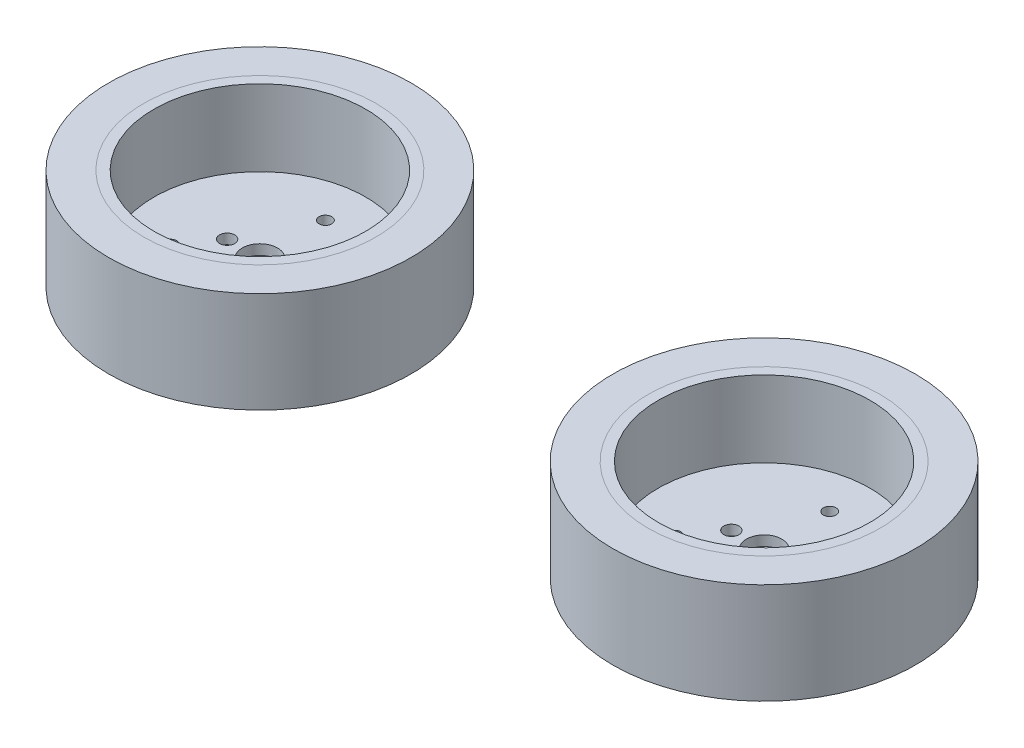
ISO-10303-21;
HEADER;
FILE_DESCRIPTION(('STEP AP214'),'2;1');
FILE_NAME('part.step','',(''),(''),'','','');
FILE_SCHEMA(('AUTOMOTIVE_DESIGN { 1 0 10303 214 1 1 1 1 }'));
ENDSEC;
DATA;
#1=APPLICATION_CONTEXT('core data for automotive mechanical design processes');
#2=APPLICATION_PROTOCOL_DEFINITION('international standard','automotive_design',2000,#1);
#3=PRODUCT_CONTEXT('',#1,'mechanical');
#4=PRODUCT('Part','Part','',(#3));
#5=PRODUCT_RELATED_PRODUCT_CATEGORY('part','',(#4));
#6=PRODUCT_DEFINITION_FORMATION('','',#4);
#7=PRODUCT_DEFINITION_CONTEXT('part definition',#1,'design');
#8=PRODUCT_DEFINITION('design','',#6,#7);
#9=PRODUCT_DEFINITION_SHAPE('','',#8);
#10=(LENGTH_UNIT() NAMED_UNIT(*) SI_UNIT(.MILLI.,.METRE.));
#11=(NAMED_UNIT(*) PLANE_ANGLE_UNIT() SI_UNIT($,.RADIAN.));
#12=(NAMED_UNIT(*) SI_UNIT($,.STERADIAN.) SOLID_ANGLE_UNIT());
#13=UNCERTAINTY_MEASURE_WITH_UNIT(LENGTH_MEASURE(1.E-05),#10,'distance_accuracy_value','');
#14=(GEOMETRIC_REPRESENTATION_CONTEXT(3) GLOBAL_UNCERTAINTY_ASSIGNED_CONTEXT((#13)) GLOBAL_UNIT_ASSIGNED_CONTEXT((#10,
#11,#12)) REPRESENTATION_CONTEXT('',''));
#15=CARTESIAN_POINT('',(0.,0.,0.));
#16=DIRECTION('',(0.,0.,1.));
#17=DIRECTION('',(1.,0.,0.));
#18=AXIS2_PLACEMENT_3D('',#15,#16,#17);
#19=CARTESIAN_POINT('',(50.,37.,0.));
#20=DIRECTION('',(0.,1.,0.));
#21=DIRECTION('',(0.,0.,1.));
#22=AXIS2_PLACEMENT_3D('',#19,#20,#21);
#23=CYLINDRICAL_SURFACE('',#22,21.);
#24=CARTESIAN_POINT('',(50.,-7.1,0.));
#25=DIRECTION('',(0.,-1.,0.));
#26=DIRECTION('',(0.,0.,1.));
#27=AXIS2_PLACEMENT_3D('',#24,#25,#26);
#28=CIRCLE('',#27,21.);
#29=CARTESIAN_POINT('',(50.,-7.1,21.));
#30=VERTEX_POINT('',#29);
#31=EDGE_CURVE('E88',#30,#30,#28,.T.);
#32=ORIENTED_EDGE('',*,*,#31,.F.);
#33=EDGE_LOOP('',(#32));
#34=FACE_BOUND('',#33,.T.);
#35=CARTESIAN_POINT('',(50.,-10.,0.));
#36=DIRECTION('',(0.,-1.,0.));
#37=DIRECTION('',(0.,0.,1.));
#38=AXIS2_PLACEMENT_3D('',#35,#36,#37);
#39=CIRCLE('',#38,21.);
#40=CARTESIAN_POINT('',(50.,-10.,21.));
#41=VERTEX_POINT('',#40);
#42=EDGE_CURVE('E11',#41,#41,#39,.T.);
#43=ORIENTED_EDGE('',*,*,#42,.T.);
#44=EDGE_LOOP('',(#43));
#45=FACE_BOUND('',#44,.T.);
#46=ADVANCED_FACE('F48',(#34,#45),#23,.F.);
#47=CARTESIAN_POINT('',(0.,-10.,0.));
#48=DIRECTION('',(0.,-1.,0.));
#49=DIRECTION('',(0.,0.,-1.));
#50=AXIS2_PLACEMENT_3D('',#47,#48,#49);
#51=PLANE('',#50);
#52=ORIENTED_EDGE('',*,*,#42,.F.);
#53=EDGE_LOOP('',(#52));
#54=FACE_BOUND('',#53,.T.);
#55=CARTESIAN_POINT('',(50.,-10.,0.));
#56=DIRECTION('',(0.,-1.,0.));
#57=DIRECTION('',(0.,0.,1.));
#58=AXIS2_PLACEMENT_3D('',#55,#56,#57);
#59=CIRCLE('',#58,23.);
#60=CARTESIAN_POINT('',(50.,-10.,23.));
#61=VERTEX_POINT('',#60);
#62=EDGE_CURVE('E54',#61,#61,#59,.T.);
#63=ORIENTED_EDGE('',*,*,#62,.T.);
#64=EDGE_LOOP('',(#63));
#65=FACE_BOUND('',#64,.T.);
#66=ADVANCED_FACE('F163',(#54,#65),#51,.T.);
#67=CARTESIAN_POINT('',(50.,37.,0.));
#68=DIRECTION('',(0.,1.,0.));
#69=DIRECTION('',(0.,0.,1.));
#70=AXIS2_PLACEMENT_3D('',#67,#68,#69);
#71=CYLINDRICAL_SURFACE('',#70,23.);
#72=ORIENTED_EDGE('',*,*,#62,.F.);
#73=EDGE_LOOP('',(#72));
#74=FACE_BOUND('',#73,.T.);
#75=CARTESIAN_POINT('',(50.,10.,0.));
#76=DIRECTION('',(0.,-1.,0.));
#77=DIRECTION('',(0.,0.,1.));
#78=AXIS2_PLACEMENT_3D('',#75,#76,#77);
#79=CIRCLE('',#78,23.);
#80=CARTESIAN_POINT('',(50.,10.,23.));
#81=VERTEX_POINT('',#80);
#82=EDGE_CURVE('E58',#81,#81,#79,.T.);
#83=ORIENTED_EDGE('',*,*,#82,.T.);
#84=EDGE_LOOP('',(#83));
#85=FACE_BOUND('',#84,.T.);
#86=ADVANCED_FACE('F158',(#74,#85),#71,.T.);
#87=CARTESIAN_POINT('',(0.,10.,0.));
#88=DIRECTION('',(0.,-1.,0.));
#89=DIRECTION('',(0.,0.,-1.));
#90=AXIS2_PLACEMENT_3D('',#87,#88,#89);
#91=PLANE('',#90);
#92=CARTESIAN_POINT('',(50.,10.,0.));
#93=DIRECTION('',(0.,-1.,0.));
#94=DIRECTION('',(0.,0.,1.));
#95=AXIS2_PLACEMENT_3D('',#92,#93,#94);
#96=CIRCLE('',#95,21.);
#97=CARTESIAN_POINT('',(50.,10.,21.));
#98=VERTEX_POINT('',#97);
#99=EDGE_CURVE('E62',#98,#98,#96,.T.);
#100=ORIENTED_EDGE('',*,*,#99,.T.);
#101=EDGE_LOOP('',(#100));
#102=FACE_BOUND('',#101,.T.);
#103=ORIENTED_EDGE('',*,*,#82,.F.);
#104=EDGE_LOOP('',(#103));
#105=FACE_BOUND('',#104,.T.);
#106=ADVANCED_FACE('F152',(#102,#105),#91,.F.);
#107=CARTESIAN_POINT('',(50.,37.,0.));
#108=DIRECTION('',(0.,1.,0.));
#109=DIRECTION('',(0.,0.,1.));
#110=AXIS2_PLACEMENT_3D('',#107,#108,#109);
#111=CYLINDRICAL_SURFACE('',#110,21.);
#112=CARTESIAN_POINT('',(50.,-5.1,0.));
#113=DIRECTION('',(0.,-1.,0.));
#114=DIRECTION('',(0.,0.,1.));
#115=AXIS2_PLACEMENT_3D('',#112,#113,#114);
#116=CIRCLE('',#115,21.);
#117=CARTESIAN_POINT('',(50.,-5.1,21.));
#118=VERTEX_POINT('',#117);
#119=EDGE_CURVE('E67',#118,#118,#116,.T.);
#120=ORIENTED_EDGE('',*,*,#119,.T.);
#121=EDGE_LOOP('',(#120));
#122=FACE_BOUND('',#121,.T.);
#123=ORIENTED_EDGE('',*,*,#99,.F.);
#124=EDGE_LOOP('',(#123));
#125=FACE_BOUND('',#124,.T.);
#126=ADVANCED_FACE('F136',(#122,#125),#111,.F.);
#127=CARTESIAN_POINT('',(0.,-5.1,0.));
#128=DIRECTION('',(0.,-1.,0.));
#129=DIRECTION('',(0.,0.,-1.));
#130=AXIS2_PLACEMENT_3D('',#127,#128,#129);
#131=PLANE('',#130);
#132=CARTESIAN_POINT('',(50.,-5.1,-13.));
#133=DIRECTION('',(0.,1.,0.));
#134=DIRECTION('',(0.,0.,-1.));
#135=AXIS2_PLACEMENT_3D('',#132,#133,#134);
#136=CIRCLE('',#135,1.24999999999999);
#137=CARTESIAN_POINT('',(50.,-5.1,-14.25));
#138=VERTEX_POINT('',#137);
#139=EDGE_CURVE('E115',#138,#138,#136,.T.);
#140=ORIENTED_EDGE('',*,*,#139,.F.);
#141=EDGE_LOOP('',(#140));
#142=FACE_BOUND('',#141,.T.);
#143=CARTESIAN_POINT('',(61.2583302491977,-5.1,6.5));
#144=DIRECTION('',(0.,1.,0.));
#145=DIRECTION('',(0.,0.,-1.));
#146=AXIS2_PLACEMENT_3D('',#143,#144,#145);
#147=CIRCLE('',#146,1.24999999999999);
#148=CARTESIAN_POINT('',(61.2583302491977,-5.1,5.25));
#149=VERTEX_POINT('',#148);
#150=EDGE_CURVE('E109',#149,#149,#147,.T.);
#151=ORIENTED_EDGE('',*,*,#150,.F.);
#152=EDGE_LOOP('',(#151));
#153=FACE_BOUND('',#152,.T.);
#154=CARTESIAN_POINT('',(38.7416697508023,-5.1,6.5));
#155=DIRECTION('',(0.,1.,0.));
#156=DIRECTION('',(0.,0.,-1.));
#157=AXIS2_PLACEMENT_3D('',#154,#155,#156);
#158=CIRCLE('',#157,1.24999999999999);
#159=CARTESIAN_POINT('',(38.7416697508023,-5.1,5.25));
#160=VERTEX_POINT('',#159);
#161=EDGE_CURVE('E101',#160,#160,#158,.T.);
#162=ORIENTED_EDGE('',*,*,#161,.F.);
#163=EDGE_LOOP('',(#162));
#164=FACE_BOUND('',#163,.T.);
#165=CARTESIAN_POINT('',(43.5,-5.1,0.));
#166=DIRECTION('',(0.,1.,0.));
#167=DIRECTION('',(0.,0.,-1.));
#168=AXIS2_PLACEMENT_3D('',#165,#166,#167);
#169=CIRCLE('',#168,1.5);
#170=CARTESIAN_POINT('',(43.5,-5.1,-1.5));
#171=VERTEX_POINT('',#170);
#172=EDGE_CURVE('E91',#171,#171,#169,.T.);
#173=ORIENTED_EDGE('',*,*,#172,.F.);
#174=EDGE_LOOP('',(#173));
#175=FACE_BOUND('',#174,.T.);
#176=CARTESIAN_POINT('',(56.5,-5.1,0.));
#177=DIRECTION('',(0.,1.,0.));
#178=DIRECTION('',(0.,0.,-1.));
#179=AXIS2_PLACEMENT_3D('',#176,#177,#178);
#180=CIRCLE('',#179,1.5);
#181=CARTESIAN_POINT('',(56.5,-5.1,-1.50000000000001));
#182=VERTEX_POINT('',#181);
#183=EDGE_CURVE('E94',#182,#182,#180,.T.);
#184=ORIENTED_EDGE('',*,*,#183,.F.);
#185=EDGE_LOOP('',(#184));
#186=FACE_BOUND('',#185,.T.);
#187=CARTESIAN_POINT('',(50.,-5.10000000000001,0.));
#188=DIRECTION('',(0.,-1.,0.));
#189=DIRECTION('',(0.,0.,1.));
#190=AXIS2_PLACEMENT_3D('',#187,#188,#189);
#191=CIRCLE('',#190,3.5);
#192=CARTESIAN_POINT('',(50.,-5.10000000000001,3.5));
#193=VERTEX_POINT('',#192);
#194=EDGE_CURVE('E70',#193,#193,#191,.T.);
#195=ORIENTED_EDGE('',*,*,#194,.T.);
#196=EDGE_LOOP('',(#195));
#197=FACE_BOUND('',#196,.T.);
#198=ORIENTED_EDGE('',*,*,#119,.F.);
#199=EDGE_LOOP('',(#198));
#200=FACE_BOUND('',#199,.T.);
#201=ADVANCED_FACE('F132',(#142,#153,#164,#175,#186,#197,#200),#131,.F.);
#202=CARTESIAN_POINT('',(50.,37.,0.));
#203=DIRECTION('',(0.,1.,0.));
#204=DIRECTION('',(0.,0.,1.));
#205=AXIS2_PLACEMENT_3D('',#202,#203,#204);
#206=CYLINDRICAL_SURFACE('',#205,3.5);
#207=CARTESIAN_POINT('',(50.,-7.1,0.));
#208=DIRECTION('',(0.,-1.,0.));
#209=DIRECTION('',(0.,0.,1.));
#210=AXIS2_PLACEMENT_3D('',#207,#208,#209);
#211=CIRCLE('',#210,3.5);
#212=CARTESIAN_POINT('',(50.,-7.1,3.5));
#213=VERTEX_POINT('',#212);
#214=EDGE_CURVE('E73',#213,#213,#211,.T.);
#215=ORIENTED_EDGE('',*,*,#214,.T.);
#216=EDGE_LOOP('',(#215));
#217=FACE_BOUND('',#216,.T.);
#218=ORIENTED_EDGE('',*,*,#194,.F.);
#219=EDGE_LOOP('',(#218));
#220=FACE_BOUND('',#219,.T.);
#221=ADVANCED_FACE('F135',(#217,#220),#206,.F.);
#222=CARTESIAN_POINT('',(0.,-7.1,0.));
#223=DIRECTION('',(0.,1.,0.));
#224=DIRECTION('',(0.,0.,1.));
#225=AXIS2_PLACEMENT_3D('',#222,#223,#224);
#226=PLANE('',#225);
#227=CARTESIAN_POINT('',(43.5,-7.1,0.));
#228=DIRECTION('',(0.,1.,0.));
#229=DIRECTION('',(0.,0.,-1.));
#230=AXIS2_PLACEMENT_3D('',#227,#228,#229);
#231=CIRCLE('',#230,1.5);
#232=CARTESIAN_POINT('',(43.5,-7.1,-1.5));
#233=VERTEX_POINT('',#232);
#234=EDGE_CURVE('E97',#233,#233,#231,.T.);
#235=ORIENTED_EDGE('',*,*,#234,.T.);
#236=EDGE_LOOP('',(#235));
#237=FACE_BOUND('',#236,.T.);
#238=CARTESIAN_POINT('',(56.5,-7.1,0.));
#239=DIRECTION('',(0.,1.,0.));
#240=DIRECTION('',(0.,0.,-1.));
#241=AXIS2_PLACEMENT_3D('',#238,#239,#240);
#242=CIRCLE('',#241,1.5);
#243=CARTESIAN_POINT('',(56.5,-7.1,-1.50000000000001));
#244=VERTEX_POINT('',#243);
#245=EDGE_CURVE('E98',#244,#244,#242,.T.);
#246=ORIENTED_EDGE('',*,*,#245,.T.);
#247=EDGE_LOOP('',(#246));
#248=FACE_BOUND('',#247,.T.);
#249=CARTESIAN_POINT('',(50.,-7.1,0.));
#250=DIRECTION('',(0.,-1.,0.));
#251=DIRECTION('',(0.,0.,1.));
#252=AXIS2_PLACEMENT_3D('',#249,#250,#251);
#253=CIRCLE('',#252,10.5);
#254=CARTESIAN_POINT('',(50.,-7.1,10.5));
#255=VERTEX_POINT('',#254);
#256=EDGE_CURVE('E76',#255,#255,#253,.T.);
#257=ORIENTED_EDGE('',*,*,#256,.T.);
#258=EDGE_LOOP('',(#257));
#259=FACE_BOUND('',#258,.T.);
#260=ORIENTED_EDGE('',*,*,#214,.F.);
#261=EDGE_LOOP('',(#260));
#262=FACE_BOUND('',#261,.T.);
#263=ADVANCED_FACE('F195',(#237,#248,#259,#262),#226,.F.);
#264=CARTESIAN_POINT('',(50.,37.,0.));
#265=DIRECTION('',(0.,1.,0.));
#266=DIRECTION('',(0.,0.,1.));
#267=AXIS2_PLACEMENT_3D('',#264,#265,#266);
#268=CYLINDRICAL_SURFACE('',#267,10.5);
#269=ORIENTED_EDGE('',*,*,#256,.F.);
#270=EDGE_LOOP('',(#269));
#271=FACE_BOUND('',#270,.T.);
#272=CARTESIAN_POINT('',(50.,-10.,0.));
#273=DIRECTION('',(0.,-1.,0.));
#274=DIRECTION('',(0.,0.,1.));
#275=AXIS2_PLACEMENT_3D('',#272,#273,#274);
#276=CIRCLE('',#275,10.5);
#277=CARTESIAN_POINT('',(50.,-10.,10.5));
#278=VERTEX_POINT('',#277);
#279=EDGE_CURVE('E79',#278,#278,#276,.T.);
#280=ORIENTED_EDGE('',*,*,#279,.T.);
#281=EDGE_LOOP('',(#280));
#282=FACE_BOUND('',#281,.T.);
#283=ADVANCED_FACE('F190',(#271,#282),#268,.F.);
#284=CARTESIAN_POINT('',(0.,-10.,0.));
#285=DIRECTION('',(0.,-1.,0.));
#286=DIRECTION('',(0.,0.,-1.));
#287=AXIS2_PLACEMENT_3D('',#284,#285,#286);
#288=PLANE('',#287);
#289=CARTESIAN_POINT('',(50.,-10.,-13.));
#290=DIRECTION('',(0.,1.,0.));
#291=DIRECTION('',(0.,0.,-1.));
#292=AXIS2_PLACEMENT_3D('',#289,#290,#291);
#293=CIRCLE('',#292,1.24999999999999);
#294=CARTESIAN_POINT('',(50.,-10.,-14.25));
#295=VERTEX_POINT('',#294);
#296=EDGE_CURVE('E118',#295,#295,#293,.T.);
#297=ORIENTED_EDGE('',*,*,#296,.T.);
#298=EDGE_LOOP('',(#297));
#299=FACE_BOUND('',#298,.T.);
#300=CARTESIAN_POINT('',(61.2583302491977,-10.,6.5));
#301=DIRECTION('',(0.,1.,0.));
#302=DIRECTION('',(0.,0.,-1.));
#303=AXIS2_PLACEMENT_3D('',#300,#301,#302);
#304=CIRCLE('',#303,1.24999999999999);
#305=CARTESIAN_POINT('',(61.2583302491977,-10.,5.25));
#306=VERTEX_POINT('',#305);
#307=EDGE_CURVE('E112',#306,#306,#304,.T.);
#308=ORIENTED_EDGE('',*,*,#307,.T.);
#309=EDGE_LOOP('',(#308));
#310=FACE_BOUND('',#309,.T.);
#311=CARTESIAN_POINT('',(38.7416697508023,-10.,6.5));
#312=DIRECTION('',(0.,1.,0.));
#313=DIRECTION('',(0.,0.,-1.));
#314=AXIS2_PLACEMENT_3D('',#311,#312,#313);
#315=CIRCLE('',#314,1.24999999999999);
#316=CARTESIAN_POINT('',(38.7416697508023,-10.,5.25));
#317=VERTEX_POINT('',#316);
#318=EDGE_CURVE('E106',#317,#317,#315,.T.);
#319=ORIENTED_EDGE('',*,*,#318,.T.);
#320=EDGE_LOOP('',(#319));
#321=FACE_BOUND('',#320,.T.);
#322=ORIENTED_EDGE('',*,*,#279,.F.);
#323=EDGE_LOOP('',(#322));
#324=FACE_BOUND('',#323,.T.);
#325=CARTESIAN_POINT('',(50.,-10.,0.));
#326=DIRECTION('',(0.,-1.,0.));
#327=DIRECTION('',(0.,0.,1.));
#328=AXIS2_PLACEMENT_3D('',#325,#326,#327);
#329=CIRCLE('',#328,15.5);
#330=CARTESIAN_POINT('',(50.,-10.,15.5));
#331=VERTEX_POINT('',#330);
#332=EDGE_CURVE('E82',#331,#331,#329,.T.);
#333=ORIENTED_EDGE('',*,*,#332,.T.);
#334=EDGE_LOOP('',(#333));
#335=FACE_BOUND('',#334,.T.);
#336=ADVANCED_FACE('F122',(#299,#310,#321,#324,#335),#288,.T.);
#337=CARTESIAN_POINT('',(50.,37.,0.));
#338=DIRECTION('',(0.,1.,0.));
#339=DIRECTION('',(0.,0.,1.));
#340=AXIS2_PLACEMENT_3D('',#337,#338,#339);
#341=CYLINDRICAL_SURFACE('',#340,15.5);
#342=CARTESIAN_POINT('',(50.,-7.1,0.));
#343=DIRECTION('',(0.,-1.,0.));
#344=DIRECTION('',(0.,0.,1.));
#345=AXIS2_PLACEMENT_3D('',#342,#343,#344);
#346=CIRCLE('',#345,15.5);
#347=CARTESIAN_POINT('',(50.,-7.1,15.5));
#348=VERTEX_POINT('',#347);
#349=EDGE_CURVE('E85',#348,#348,#346,.T.);
#350=ORIENTED_EDGE('',*,*,#349,.T.);
#351=EDGE_LOOP('',(#350));
#352=FACE_BOUND('',#351,.T.);
#353=ORIENTED_EDGE('',*,*,#332,.F.);
#354=EDGE_LOOP('',(#353));
#355=FACE_BOUND('',#354,.T.);
#356=ADVANCED_FACE('F180',(#352,#355),#341,.T.);
#357=CARTESIAN_POINT('',(0.,-7.1,0.));
#358=DIRECTION('',(0.,1.,0.));
#359=DIRECTION('',(0.,0.,1.));
#360=AXIS2_PLACEMENT_3D('',#357,#358,#359);
#361=PLANE('',#360);
#362=ORIENTED_EDGE('',*,*,#31,.T.);
#363=EDGE_LOOP('',(#362));
#364=FACE_BOUND('',#363,.T.);
#365=ORIENTED_EDGE('',*,*,#349,.F.);
#366=EDGE_LOOP('',(#365));
#367=FACE_BOUND('',#366,.T.);
#368=ADVANCED_FACE('F176',(#364,#367),#361,.F.);
#369=CARTESIAN_POINT('',(56.5,10.,0.));
#370=DIRECTION('',(0.,-1.,0.));
#371=DIRECTION('',(0.,0.,-1.));
#372=AXIS2_PLACEMENT_3D('',#369,#370,#371);
#373=CYLINDRICAL_SURFACE('',#372,1.5);
#374=ORIENTED_EDGE('',*,*,#245,.F.);
#375=EDGE_LOOP('',(#374));
#376=FACE_BOUND('',#375,.T.);
#377=ORIENTED_EDGE('',*,*,#183,.T.);
#378=EDGE_LOOP('',(#377));
#379=FACE_BOUND('',#378,.T.);
#380=ADVANCED_FACE('F179',(#376,#379),#373,.F.);
#381=CARTESIAN_POINT('',(43.5,10.,0.));
#382=DIRECTION('',(0.,-1.,0.));
#383=DIRECTION('',(0.,0.,-1.));
#384=AXIS2_PLACEMENT_3D('',#381,#382,#383);
#385=CYLINDRICAL_SURFACE('',#384,1.5);
#386=ORIENTED_EDGE('',*,*,#234,.F.);
#387=EDGE_LOOP('',(#386));
#388=FACE_BOUND('',#387,.T.);
#389=ORIENTED_EDGE('',*,*,#172,.T.);
#390=EDGE_LOOP('',(#389));
#391=FACE_BOUND('',#390,.T.);
#392=ADVANCED_FACE('F263',(#388,#391),#385,.F.);
#393=CARTESIAN_POINT('',(38.7416697508023,-10.,6.5));
#394=DIRECTION('',(0.,-1.,0.));
#395=DIRECTION('',(0.,0.,-1.));
#396=AXIS2_PLACEMENT_3D('',#393,#394,#395);
#397=CYLINDRICAL_SURFACE('',#396,1.24999999999999);
#398=ORIENTED_EDGE('',*,*,#318,.F.);
#399=EDGE_LOOP('',(#398));
#400=FACE_BOUND('',#399,.T.);
#401=ORIENTED_EDGE('',*,*,#161,.T.);
#402=EDGE_LOOP('',(#401));
#403=FACE_BOUND('',#402,.T.);
#404=ADVANCED_FACE('F258',(#400,#403),#397,.F.);
#405=CARTESIAN_POINT('',(61.2583302491977,-10.,6.5));
#406=DIRECTION('',(0.,-1.,0.));
#407=DIRECTION('',(0.,0.,-1.));
#408=AXIS2_PLACEMENT_3D('',#405,#406,#407);
#409=CYLINDRICAL_SURFACE('',#408,1.24999999999999);
#410=ORIENTED_EDGE('',*,*,#307,.F.);
#411=EDGE_LOOP('',(#410));
#412=FACE_BOUND('',#411,.T.);
#413=ORIENTED_EDGE('',*,*,#150,.T.);
#414=EDGE_LOOP('',(#413));
#415=FACE_BOUND('',#414,.T.);
#416=ADVANCED_FACE('F128',(#412,#415),#409,.F.);
#417=CARTESIAN_POINT('',(50.,-10.,-13.));
#418=DIRECTION('',(0.,-1.,0.));
#419=DIRECTION('',(0.,0.,-1.));
#420=AXIS2_PLACEMENT_3D('',#417,#418,#419);
#421=CYLINDRICAL_SURFACE('',#420,1.24999999999999);
#422=ORIENTED_EDGE('',*,*,#296,.F.);
#423=EDGE_LOOP('',(#422));
#424=FACE_BOUND('',#423,.T.);
#425=ORIENTED_EDGE('',*,*,#139,.T.);
#426=EDGE_LOOP('',(#425));
#427=FACE_BOUND('',#426,.T.);
#428=ADVANCED_FACE('F125',(#424,#427),#421,.F.);
#429=CLOSED_SHELL('',(#46,#66,#86,#106,#126,#201,#221,#263,#283,#336,#356,#368,#380,#392,#404,
#416,#428));
#430=MANIFOLD_SOLID_BREP('B2',#429);
#431=CARTESIAN_POINT('',(50.,37.,0.));
#432=DIRECTION('',(0.,1.,0.));
#433=DIRECTION('',(0.,0.,1.));
#434=AXIS2_PLACEMENT_3D('',#431,#432,#433);
#435=CYLINDRICAL_SURFACE('',#434,30.);
#436=CARTESIAN_POINT('',(50.,-10.,0.));
#437=DIRECTION('',(0.,-1.,0.));
#438=DIRECTION('',(0.,0.,1.));
#439=AXIS2_PLACEMENT_3D('',#436,#437,#438);
#440=CIRCLE('',#439,30.);
#441=CARTESIAN_POINT('',(50.,-10.,30.));
#442=VERTEX_POINT('',#441);
#443=EDGE_CURVE('E406',#442,#442,#440,.T.);
#444=ORIENTED_EDGE('',*,*,#443,.F.);
#445=EDGE_LOOP('',(#444));
#446=FACE_BOUND('',#445,.T.);
#447=CARTESIAN_POINT('',(50.,10.,0.));
#448=DIRECTION('',(0.,-1.,0.));
#449=DIRECTION('',(0.,0.,1.));
#450=AXIS2_PLACEMENT_3D('',#447,#448,#449);
#451=CIRCLE('',#450,30.);
#452=CARTESIAN_POINT('',(50.,10.,30.));
#453=VERTEX_POINT('',#452);
#454=EDGE_CURVE('E47',#453,#453,#451,.T.);
#455=ORIENTED_EDGE('',*,*,#454,.T.);
#456=EDGE_LOOP('',(#455));
#457=FACE_BOUND('',#456,.T.);
#458=ADVANCED_FACE('F392',(#446,#457),#435,.T.);
#459=CARTESIAN_POINT('',(0.,10.,0.));
#460=DIRECTION('',(0.,1.,0.));
#461=DIRECTION('',(0.,0.,1.));
#462=AXIS2_PLACEMENT_3D('',#459,#460,#461);
#463=PLANE('',#462);
#464=ORIENTED_EDGE('',*,*,#454,.F.);
#465=EDGE_LOOP('',(#464));
#466=FACE_BOUND('',#465,.T.);
#467=CARTESIAN_POINT('',(50.,10.,0.));
#468=DIRECTION('',(0.,-1.,0.));
#469=DIRECTION('',(0.,0.,1.));
#470=AXIS2_PLACEMENT_3D('',#467,#468,#469);
#471=CIRCLE('',#470,23.);
#472=CARTESIAN_POINT('',(50.,10.,23.));
#473=VERTEX_POINT('',#472);
#474=EDGE_CURVE('E398',#473,#473,#471,.T.);
#475=ORIENTED_EDGE('',*,*,#474,.T.);
#476=EDGE_LOOP('',(#475));
#477=FACE_BOUND('',#476,.T.);
#478=ADVANCED_FACE('F416',(#466,#477),#463,.T.);
#479=CARTESIAN_POINT('',(50.,37.,0.));
#480=DIRECTION('',(0.,1.,0.));
#481=DIRECTION('',(0.,0.,1.));
#482=AXIS2_PLACEMENT_3D('',#479,#480,#481);
#483=CYLINDRICAL_SURFACE('',#482,23.);
#484=CARTESIAN_POINT('',(50.,-10.,0.));
#485=DIRECTION('',(0.,-1.,0.));
#486=DIRECTION('',(0.,0.,1.));
#487=AXIS2_PLACEMENT_3D('',#484,#485,#486);
#488=CIRCLE('',#487,23.);
#489=CARTESIAN_POINT('',(50.,-10.,23.));
#490=VERTEX_POINT('',#489);
#491=EDGE_CURVE('E402',#490,#490,#488,.T.);
#492=ORIENTED_EDGE('',*,*,#491,.T.);
#493=EDGE_LOOP('',(#492));
#494=FACE_BOUND('',#493,.T.);
#495=ORIENTED_EDGE('',*,*,#474,.F.);
#496=EDGE_LOOP('',(#495));
#497=FACE_BOUND('',#496,.T.);
#498=ADVANCED_FACE('F420',(#494,#497),#483,.F.);
#499=CARTESIAN_POINT('',(0.,-10.,0.));
#500=DIRECTION('',(0.,1.,0.));
#501=DIRECTION('',(0.,0.,1.));
#502=AXIS2_PLACEMENT_3D('',#499,#500,#501);
#503=PLANE('',#502);
#504=ORIENTED_EDGE('',*,*,#443,.T.);
#505=EDGE_LOOP('',(#504));
#506=FACE_BOUND('',#505,.T.);
#507=ORIENTED_EDGE('',*,*,#491,.F.);
#508=EDGE_LOOP('',(#507));
#509=FACE_BOUND('',#508,.T.);
#510=ADVANCED_FACE('F412',(#506,#509),#503,.F.);
#511=CLOSED_SHELL('',(#458,#478,#498,#510));
#512=MANIFOLD_SOLID_BREP('B6',#511);
#513=CARTESIAN_POINT('',(-50.,37.,0.));
#514=DIRECTION('',(0.,1.,0.));
#515=DIRECTION('',(0.,0.,1.));
#516=AXIS2_PLACEMENT_3D('',#513,#514,#515);
#517=CYLINDRICAL_SURFACE('',#516,21.);
#518=CARTESIAN_POINT('',(-50.,-7.1,0.));
#519=DIRECTION('',(0.,1.,0.));
#520=DIRECTION('',(0.,0.,1.));
#521=AXIS2_PLACEMENT_3D('',#518,#519,#520);
#522=CIRCLE('',#521,21.);
#523=CARTESIAN_POINT('',(-50.,-7.1,21.));
#524=VERTEX_POINT('',#523);
#525=EDGE_CURVE('E524',#524,#524,#522,.T.);
#526=ORIENTED_EDGE('',*,*,#525,.T.);
#527=EDGE_LOOP('',(#526));
#528=FACE_BOUND('',#527,.T.);
#529=CARTESIAN_POINT('',(-50.,-10.,0.));
#530=DIRECTION('',(0.,1.,0.));
#531=DIRECTION('',(0.,0.,1.));
#532=AXIS2_PLACEMENT_3D('',#529,#530,#531);
#533=CIRCLE('',#532,21.);
#534=CARTESIAN_POINT('',(-50.,-10.,21.));
#535=VERTEX_POINT('',#534);
#536=EDGE_CURVE('E391',#535,#535,#533,.T.);
#537=ORIENTED_EDGE('',*,*,#536,.F.);
#538=EDGE_LOOP('',(#537));
#539=FACE_BOUND('',#538,.T.);
#540=ADVANCED_FACE('F484',(#528,#539),#517,.F.);
#541=CARTESIAN_POINT('',(0.,-10.,0.));
#542=DIRECTION('',(0.,-1.,0.));
#543=DIRECTION('',(0.,0.,-1.));
#544=AXIS2_PLACEMENT_3D('',#541,#542,#543);
#545=PLANE('',#544);
#546=ORIENTED_EDGE('',*,*,#536,.T.);
#547=EDGE_LOOP('',(#546));
#548=FACE_BOUND('',#547,.T.);
#549=CARTESIAN_POINT('',(-50.,-10.,0.));
#550=DIRECTION('',(0.,1.,0.));
#551=DIRECTION('',(0.,0.,1.));
#552=AXIS2_PLACEMENT_3D('',#549,#550,#551);
#553=CIRCLE('',#552,23.);
#554=CARTESIAN_POINT('',(-50.,-10.,23.));
#555=VERTEX_POINT('',#554);
#556=EDGE_CURVE('E490',#555,#555,#553,.T.);
#557=ORIENTED_EDGE('',*,*,#556,.F.);
#558=EDGE_LOOP('',(#557));
#559=FACE_BOUND('',#558,.T.);
#560=ADVANCED_FACE('F587',(#548,#559),#545,.T.);
#561=CARTESIAN_POINT('',(-50.,37.,0.));
#562=DIRECTION('',(0.,1.,0.));
#563=DIRECTION('',(0.,0.,1.));
#564=AXIS2_PLACEMENT_3D('',#561,#562,#563);
#565=CYLINDRICAL_SURFACE('',#564,23.);
#566=ORIENTED_EDGE('',*,*,#556,.T.);
#567=EDGE_LOOP('',(#566));
#568=FACE_BOUND('',#567,.T.);
#569=CARTESIAN_POINT('',(-50.,10.,0.));
#570=DIRECTION('',(0.,1.,0.));
#571=DIRECTION('',(0.,0.,1.));
#572=AXIS2_PLACEMENT_3D('',#569,#570,#571);
#573=CIRCLE('',#572,23.);
#574=CARTESIAN_POINT('',(-50.,10.,23.));
#575=VERTEX_POINT('',#574);
#576=EDGE_CURVE('E494',#575,#575,#573,.T.);
#577=ORIENTED_EDGE('',*,*,#576,.F.);
#578=EDGE_LOOP('',(#577));
#579=FACE_BOUND('',#578,.T.);
#580=ADVANCED_FACE('F592',(#568,#579),#565,.T.);
#581=CARTESIAN_POINT('',(0.,10.,0.));
#582=DIRECTION('',(0.,-1.,0.));
#583=DIRECTION('',(0.,0.,-1.));
#584=AXIS2_PLACEMENT_3D('',#581,#582,#583);
#585=PLANE('',#584);
#586=CARTESIAN_POINT('',(-50.,10.,0.));
#587=DIRECTION('',(0.,1.,0.));
#588=DIRECTION('',(0.,0.,1.));
#589=AXIS2_PLACEMENT_3D('',#586,#587,#588);
#590=CIRCLE('',#589,21.);
#591=CARTESIAN_POINT('',(-50.,10.,21.));
#592=VERTEX_POINT('',#591);
#593=EDGE_CURVE('E498',#592,#592,#590,.T.);
#594=ORIENTED_EDGE('',*,*,#593,.F.);
#595=EDGE_LOOP('',(#594));
#596=FACE_BOUND('',#595,.T.);
#597=ORIENTED_EDGE('',*,*,#576,.T.);
#598=EDGE_LOOP('',(#597));
#599=FACE_BOUND('',#598,.T.);
#600=ADVANCED_FACE('F599',(#596,#599),#585,.F.);
#601=CARTESIAN_POINT('',(-50.,37.,0.));
#602=DIRECTION('',(0.,1.,0.));
#603=DIRECTION('',(0.,0.,1.));
#604=AXIS2_PLACEMENT_3D('',#601,#602,#603);
#605=CYLINDRICAL_SURFACE('',#604,21.);
#606=CARTESIAN_POINT('',(-50.,-5.1,0.));
#607=DIRECTION('',(0.,1.,0.));
#608=DIRECTION('',(0.,0.,1.));
#609=AXIS2_PLACEMENT_3D('',#606,#607,#608);
#610=CIRCLE('',#609,21.);
#611=CARTESIAN_POINT('',(-50.,-5.1,21.));
#612=VERTEX_POINT('',#611);
#613=EDGE_CURVE('E503',#612,#612,#610,.T.);
#614=ORIENTED_EDGE('',*,*,#613,.F.);
#615=EDGE_LOOP('',(#614));
#616=FACE_BOUND('',#615,.T.);
#617=ORIENTED_EDGE('',*,*,#593,.T.);
#618=EDGE_LOOP('',(#617));
#619=FACE_BOUND('',#618,.T.);
#620=ADVANCED_FACE('F605',(#616,#619),#605,.F.);
#621=CARTESIAN_POINT('',(0.,-5.1,0.));
#622=DIRECTION('',(0.,-1.,0.));
#623=DIRECTION('',(0.,0.,-1.));
#624=AXIS2_PLACEMENT_3D('',#621,#622,#623);
#625=PLANE('',#624);
#626=CARTESIAN_POINT('',(-50.,-5.1,-13.));
#627=DIRECTION('',(0.,-1.,0.));
#628=DIRECTION('',(0.,0.,-1.));
#629=AXIS2_PLACEMENT_3D('',#626,#627,#628);
#630=CIRCLE('',#629,1.24999999999999);
#631=CARTESIAN_POINT('',(-50.,-5.1,-14.25));
#632=VERTEX_POINT('',#631);
#633=EDGE_CURVE('E551',#632,#632,#630,.T.);
#634=ORIENTED_EDGE('',*,*,#633,.T.);
#635=EDGE_LOOP('',(#634));
#636=FACE_BOUND('',#635,.T.);
#637=CARTESIAN_POINT('',(-61.2583302491977,-5.1,6.5));
#638=DIRECTION('',(0.,-1.,0.));
#639=DIRECTION('',(0.,0.,-1.));
#640=AXIS2_PLACEMENT_3D('',#637,#638,#639);
#641=CIRCLE('',#640,1.24999999999999);
#642=CARTESIAN_POINT('',(-61.2583302491977,-5.1,5.25));
#643=VERTEX_POINT('',#642);
#644=EDGE_CURVE('E545',#643,#643,#641,.T.);
#645=ORIENTED_EDGE('',*,*,#644,.T.);
#646=EDGE_LOOP('',(#645));
#647=FACE_BOUND('',#646,.T.);
#648=CARTESIAN_POINT('',(-38.7416697508023,-5.1,6.5));
#649=DIRECTION('',(0.,-1.,0.));
#650=DIRECTION('',(0.,0.,-1.));
#651=AXIS2_PLACEMENT_3D('',#648,#649,#650);
#652=CIRCLE('',#651,1.24999999999999);
#653=CARTESIAN_POINT('',(-38.7416697508023,-5.1,5.25));
#654=VERTEX_POINT('',#653);
#655=EDGE_CURVE('E537',#654,#654,#652,.T.);
#656=ORIENTED_EDGE('',*,*,#655,.T.);
#657=EDGE_LOOP('',(#656));
#658=FACE_BOUND('',#657,.T.);
#659=CARTESIAN_POINT('',(-43.5,-5.1,0.));
#660=DIRECTION('',(0.,-1.,0.));
#661=DIRECTION('',(0.,0.,-1.));
#662=AXIS2_PLACEMENT_3D('',#659,#660,#661);
#663=CIRCLE('',#662,1.5);
#664=CARTESIAN_POINT('',(-43.5,-5.1,-1.5));
#665=VERTEX_POINT('',#664);
#666=EDGE_CURVE('E527',#665,#665,#663,.T.);
#667=ORIENTED_EDGE('',*,*,#666,.T.);
#668=EDGE_LOOP('',(#667));
#669=FACE_BOUND('',#668,.T.);
#670=CARTESIAN_POINT('',(-56.5,-5.1,0.));
#671=DIRECTION('',(0.,-1.,0.));
#672=DIRECTION('',(0.,0.,-1.));
#673=AXIS2_PLACEMENT_3D('',#670,#671,#672);
#674=CIRCLE('',#673,1.5);
#675=CARTESIAN_POINT('',(-56.5,-5.1,-1.50000000000001));
#676=VERTEX_POINT('',#675);
#677=EDGE_CURVE('E530',#676,#676,#674,.T.);
#678=ORIENTED_EDGE('',*,*,#677,.T.);
#679=EDGE_LOOP('',(#678));
#680=FACE_BOUND('',#679,.T.);
#681=CARTESIAN_POINT('',(-50.,-5.10000000000001,0.));
#682=DIRECTION('',(0.,1.,0.));
#683=DIRECTION('',(0.,0.,1.));
#684=AXIS2_PLACEMENT_3D('',#681,#682,#683);
#685=CIRCLE('',#684,3.5);
#686=CARTESIAN_POINT('',(-50.,-5.10000000000001,3.5));
#687=VERTEX_POINT('',#686);
#688=EDGE_CURVE('E506',#687,#687,#685,.T.);
#689=ORIENTED_EDGE('',*,*,#688,.F.);
#690=EDGE_LOOP('',(#689));
#691=FACE_BOUND('',#690,.T.);
#692=ORIENTED_EDGE('',*,*,#613,.T.);
#693=EDGE_LOOP('',(#692));
#694=FACE_BOUND('',#693,.T.);
#695=ADVANCED_FACE('F609',(#636,#647,#658,#669,#680,#691,#694),#625,.F.);
#696=CARTESIAN_POINT('',(-50.,37.,0.));
#697=DIRECTION('',(0.,1.,0.));
#698=DIRECTION('',(0.,0.,1.));
#699=AXIS2_PLACEMENT_3D('',#696,#697,#698);
#700=CYLINDRICAL_SURFACE('',#699,3.5);
#701=CARTESIAN_POINT('',(-50.,-7.1,0.));
#702=DIRECTION('',(0.,1.,0.));
#703=DIRECTION('',(0.,0.,1.));
#704=AXIS2_PLACEMENT_3D('',#701,#702,#703);
#705=CIRCLE('',#704,3.5);
#706=CARTESIAN_POINT('',(-50.,-7.1,3.5));
#707=VERTEX_POINT('',#706);
#708=EDGE_CURVE('E509',#707,#707,#705,.T.);
#709=ORIENTED_EDGE('',*,*,#708,.F.);
#710=EDGE_LOOP('',(#709));
#711=FACE_BOUND('',#710,.T.);
#712=ORIENTED_EDGE('',*,*,#688,.T.);
#713=EDGE_LOOP('',(#712));
#714=FACE_BOUND('',#713,.T.);
#715=ADVANCED_FACE('F613',(#711,#714),#700,.F.);
#716=CARTESIAN_POINT('',(0.,-7.1,0.));
#717=DIRECTION('',(0.,1.,0.));
#718=DIRECTION('',(0.,0.,1.));
#719=AXIS2_PLACEMENT_3D('',#716,#717,#718);
#720=PLANE('',#719);
#721=CARTESIAN_POINT('',(-43.5,-7.1,0.));
#722=DIRECTION('',(0.,-1.,0.));
#723=DIRECTION('',(0.,0.,-1.));
#724=AXIS2_PLACEMENT_3D('',#721,#722,#723);
#725=CIRCLE('',#724,1.5);
#726=CARTESIAN_POINT('',(-43.5,-7.1,-1.5));
#727=VERTEX_POINT('',#726);
#728=EDGE_CURVE('E533',#727,#727,#725,.T.);
#729=ORIENTED_EDGE('',*,*,#728,.F.);
#730=EDGE_LOOP('',(#729));
#731=FACE_BOUND('',#730,.T.);
#732=CARTESIAN_POINT('',(-56.5,-7.1,0.));
#733=DIRECTION('',(0.,-1.,0.));
#734=DIRECTION('',(0.,0.,-1.));
#735=AXIS2_PLACEMENT_3D('',#732,#733,#734);
#736=CIRCLE('',#735,1.5);
#737=CARTESIAN_POINT('',(-56.5,-7.1,-1.50000000000001));
#738=VERTEX_POINT('',#737);
#739=EDGE_CURVE('E534',#738,#738,#736,.T.);
#740=ORIENTED_EDGE('',*,*,#739,.F.);
#741=EDGE_LOOP('',(#740));
#742=FACE_BOUND('',#741,.T.);
#743=CARTESIAN_POINT('',(-50.,-7.1,0.));
#744=DIRECTION('',(0.,1.,0.));
#745=DIRECTION('',(0.,0.,1.));
#746=AXIS2_PLACEMENT_3D('',#743,#744,#745);
#747=CIRCLE('',#746,10.5);
#748=CARTESIAN_POINT('',(-50.,-7.1,10.5));
#749=VERTEX_POINT('',#748);
#750=EDGE_CURVE('E512',#749,#749,#747,.T.);
#751=ORIENTED_EDGE('',*,*,#750,.F.);
#752=EDGE_LOOP('',(#751));
#753=FACE_BOUND('',#752,.T.);
#754=ORIENTED_EDGE('',*,*,#708,.T.);
#755=EDGE_LOOP('',(#754));
#756=FACE_BOUND('',#755,.T.);
#757=ADVANCED_FACE('F617',(#731,#742,#753,#756),#720,.F.);
#758=CARTESIAN_POINT('',(-50.,37.,0.));
#759=DIRECTION('',(0.,1.,0.));
#760=DIRECTION('',(0.,0.,1.));
#761=AXIS2_PLACEMENT_3D('',#758,#759,#760);
#762=CYLINDRICAL_SURFACE('',#761,10.5);
#763=ORIENTED_EDGE('',*,*,#750,.T.);
#764=EDGE_LOOP('',(#763));
#765=FACE_BOUND('',#764,.T.);
#766=CARTESIAN_POINT('',(-50.,-10.,0.));
#767=DIRECTION('',(0.,1.,0.));
#768=DIRECTION('',(0.,0.,1.));
#769=AXIS2_PLACEMENT_3D('',#766,#767,#768);
#770=CIRCLE('',#769,10.5);
#771=CARTESIAN_POINT('',(-50.,-10.,10.5));
#772=VERTEX_POINT('',#771);
#773=EDGE_CURVE('E515',#772,#772,#770,.T.);
#774=ORIENTED_EDGE('',*,*,#773,.F.);
#775=EDGE_LOOP('',(#774));
#776=FACE_BOUND('',#775,.T.);
#777=ADVANCED_FACE('F565',(#765,#776),#762,.F.);
#778=CARTESIAN_POINT('',(0.,-10.,0.));
#779=DIRECTION('',(0.,-1.,0.));
#780=DIRECTION('',(0.,0.,-1.));
#781=AXIS2_PLACEMENT_3D('',#778,#779,#780);
#782=PLANE('',#781);
#783=CARTESIAN_POINT('',(-50.,-10.,-13.));
#784=DIRECTION('',(0.,-1.,0.));
#785=DIRECTION('',(0.,0.,-1.));
#786=AXIS2_PLACEMENT_3D('',#783,#784,#785);
#787=CIRCLE('',#786,1.24999999999999);
#788=CARTESIAN_POINT('',(-50.,-10.,-14.25));
#789=VERTEX_POINT('',#788);
#790=EDGE_CURVE('E554',#789,#789,#787,.T.);
#791=ORIENTED_EDGE('',*,*,#790,.F.);
#792=EDGE_LOOP('',(#791));
#793=FACE_BOUND('',#792,.T.);
#794=CARTESIAN_POINT('',(-61.2583302491977,-10.,6.5));
#795=DIRECTION('',(0.,-1.,0.));
#796=DIRECTION('',(0.,0.,-1.));
#797=AXIS2_PLACEMENT_3D('',#794,#795,#796);
#798=CIRCLE('',#797,1.24999999999999);
#799=CARTESIAN_POINT('',(-61.2583302491977,-10.,5.25));
#800=VERTEX_POINT('',#799);
#801=EDGE_CURVE('E548',#800,#800,#798,.T.);
#802=ORIENTED_EDGE('',*,*,#801,.F.);
#803=EDGE_LOOP('',(#802));
#804=FACE_BOUND('',#803,.T.);
#805=CARTESIAN_POINT('',(-38.7416697508023,-10.,6.5));
#806=DIRECTION('',(0.,-1.,0.));
#807=DIRECTION('',(0.,0.,-1.));
#808=AXIS2_PLACEMENT_3D('',#805,#806,#807);
#809=CIRCLE('',#808,1.24999999999999);
#810=CARTESIAN_POINT('',(-38.7416697508023,-10.,5.25));
#811=VERTEX_POINT('',#810);
#812=EDGE_CURVE('E542',#811,#811,#809,.T.);
#813=ORIENTED_EDGE('',*,*,#812,.F.);
#814=EDGE_LOOP('',(#813));
#815=FACE_BOUND('',#814,.T.);
#816=ORIENTED_EDGE('',*,*,#773,.T.);
#817=EDGE_LOOP('',(#816));
#818=FACE_BOUND('',#817,.T.);
#819=CARTESIAN_POINT('',(-50.,-10.,0.));
#820=DIRECTION('',(0.,1.,0.));
#821=DIRECTION('',(0.,0.,1.));
#822=AXIS2_PLACEMENT_3D('',#819,#820,#821);
#823=CIRCLE('',#822,15.5);
#824=CARTESIAN_POINT('',(-50.,-10.,15.5));
#825=VERTEX_POINT('',#824);
#826=EDGE_CURVE('E518',#825,#825,#823,.T.);
#827=ORIENTED_EDGE('',*,*,#826,.F.);
#828=EDGE_LOOP('',(#827));
#829=FACE_BOUND('',#828,.T.);
#830=ADVANCED_FACE('F561',(#793,#804,#815,#818,#829),#782,.T.);
#831=CARTESIAN_POINT('',(-50.,37.,0.));
#832=DIRECTION('',(0.,1.,0.));
#833=DIRECTION('',(0.,0.,1.));
#834=AXIS2_PLACEMENT_3D('',#831,#832,#833);
#835=CYLINDRICAL_SURFACE('',#834,15.5);
#836=CARTESIAN_POINT('',(-50.,-7.1,0.));
#837=DIRECTION('',(0.,1.,0.));
#838=DIRECTION('',(0.,0.,1.));
#839=AXIS2_PLACEMENT_3D('',#836,#837,#838);
#840=CIRCLE('',#839,15.5);
#841=CARTESIAN_POINT('',(-50.,-7.1,15.5));
#842=VERTEX_POINT('',#841);
#843=EDGE_CURVE('E521',#842,#842,#840,.T.);
#844=ORIENTED_EDGE('',*,*,#843,.F.);
#845=EDGE_LOOP('',(#844));
#846=FACE_BOUND('',#845,.T.);
#847=ORIENTED_EDGE('',*,*,#826,.T.);
#848=EDGE_LOOP('',(#847));
#849=FACE_BOUND('',#848,.T.);
#850=ADVANCED_FACE('F564',(#846,#849),#835,.T.);
#851=CARTESIAN_POINT('',(0.,-7.1,0.));
#852=DIRECTION('',(0.,1.,0.));
#853=DIRECTION('',(0.,0.,1.));
#854=AXIS2_PLACEMENT_3D('',#851,#852,#853);
#855=PLANE('',#854);
#856=ORIENTED_EDGE('',*,*,#525,.F.);
#857=EDGE_LOOP('',(#856));
#858=FACE_BOUND('',#857,.T.);
#859=ORIENTED_EDGE('',*,*,#843,.T.);
#860=EDGE_LOOP('',(#859));
#861=FACE_BOUND('',#860,.T.);
#862=ADVANCED_FACE('F576',(#858,#861),#855,.F.);
#863=CARTESIAN_POINT('',(-56.5,10.,0.));
#864=DIRECTION('',(0.,-1.,0.));
#865=DIRECTION('',(0.,0.,-1.));
#866=AXIS2_PLACEMENT_3D('',#863,#864,#865);
#867=CYLINDRICAL_SURFACE('',#866,1.5);
#868=ORIENTED_EDGE('',*,*,#739,.T.);
#869=EDGE_LOOP('',(#868));
#870=FACE_BOUND('',#869,.T.);
#871=ORIENTED_EDGE('',*,*,#677,.F.);
#872=EDGE_LOOP('',(#871));
#873=FACE_BOUND('',#872,.T.);
#874=ADVANCED_FACE('F582',(#870,#873),#867,.F.);
#875=CARTESIAN_POINT('',(-43.5,10.,0.));
#876=DIRECTION('',(0.,-1.,0.));
#877=DIRECTION('',(0.,0.,-1.));
#878=AXIS2_PLACEMENT_3D('',#875,#876,#877);
#879=CYLINDRICAL_SURFACE('',#878,1.5);
#880=ORIENTED_EDGE('',*,*,#728,.T.);
#881=EDGE_LOOP('',(#880));
#882=FACE_BOUND('',#881,.T.);
#883=ORIENTED_EDGE('',*,*,#666,.F.);
#884=EDGE_LOOP('',(#883));
#885=FACE_BOUND('',#884,.T.);
#886=ADVANCED_FACE('F665',(#882,#885),#879,.F.);
#887=CARTESIAN_POINT('',(-38.7416697508023,-10.,6.5));
#888=DIRECTION('',(0.,-1.,0.));
#889=DIRECTION('',(0.,0.,-1.));
#890=AXIS2_PLACEMENT_3D('',#887,#888,#889);
#891=CYLINDRICAL_SURFACE('',#890,1.24999999999999);
#892=ORIENTED_EDGE('',*,*,#812,.T.);
#893=EDGE_LOOP('',(#892));
#894=FACE_BOUND('',#893,.T.);
#895=ORIENTED_EDGE('',*,*,#655,.F.);
#896=EDGE_LOOP('',(#895));
#897=FACE_BOUND('',#896,.T.);
#898=ADVANCED_FACE('F658',(#894,#897),#891,.F.);
#899=CARTESIAN_POINT('',(-61.2583302491977,-10.,6.5));
#900=DIRECTION('',(0.,-1.,0.));
#901=DIRECTION('',(0.,0.,-1.));
#902=AXIS2_PLACEMENT_3D('',#899,#900,#901);
#903=CYLINDRICAL_SURFACE('',#902,1.24999999999999);
#904=ORIENTED_EDGE('',*,*,#801,.T.);
#905=EDGE_LOOP('',(#904));
#906=FACE_BOUND('',#905,.T.);
#907=ORIENTED_EDGE('',*,*,#644,.F.);
#908=EDGE_LOOP('',(#907));
#909=FACE_BOUND('',#908,.T.);
#910=ADVANCED_FACE('F664',(#906,#909),#903,.F.);
#911=CARTESIAN_POINT('',(-50.,-10.,-13.));
#912=DIRECTION('',(0.,-1.,0.));
#913=DIRECTION('',(0.,0.,-1.));
#914=AXIS2_PLACEMENT_3D('',#911,#912,#913);
#915=CYLINDRICAL_SURFACE('',#914,1.24999999999999);
#916=ORIENTED_EDGE('',*,*,#790,.T.);
#917=EDGE_LOOP('',(#916));
#918=FACE_BOUND('',#917,.T.);
#919=ORIENTED_EDGE('',*,*,#633,.F.);
#920=EDGE_LOOP('',(#919));
#921=FACE_BOUND('',#920,.T.);
#922=ADVANCED_FACE('F558',(#918,#921),#915,.F.);
#923=CLOSED_SHELL('',(#540,#560,#580,#600,#620,#695,#715,#757,#777,#830,#850,#862,#874,#886,
#898,#910,#922));
#924=MANIFOLD_SOLID_BREP('B42',#923);
#925=CARTESIAN_POINT('',(-50.,37.,0.));
#926=DIRECTION('',(0.,1.,0.));
#927=DIRECTION('',(0.,0.,1.));
#928=AXIS2_PLACEMENT_3D('',#925,#926,#927);
#929=CYLINDRICAL_SURFACE('',#928,30.);
#930=CARTESIAN_POINT('',(-50.,-10.,0.));
#931=DIRECTION('',(0.,1.,0.));
#932=DIRECTION('',(0.,0.,1.));
#933=AXIS2_PLACEMENT_3D('',#930,#931,#932);
#934=CIRCLE('',#933,30.);
#935=CARTESIAN_POINT('',(-50.,-10.,30.));
#936=VERTEX_POINT('',#935);
#937=EDGE_CURVE('E806',#936,#936,#934,.T.);
#938=ORIENTED_EDGE('',*,*,#937,.T.);
#939=EDGE_LOOP('',(#938));
#940=FACE_BOUND('',#939,.T.);
#941=CARTESIAN_POINT('',(-50.,10.,0.));
#942=DIRECTION('',(0.,1.,0.));
#943=DIRECTION('',(0.,0.,1.));
#944=AXIS2_PLACEMENT_3D('',#941,#942,#943);
#945=CIRCLE('',#944,30.);
#946=CARTESIAN_POINT('',(-50.,10.,30.));
#947=VERTEX_POINT('',#946);
#948=EDGE_CURVE('E483',#947,#947,#945,.T.);
#949=ORIENTED_EDGE('',*,*,#948,.F.);
#950=EDGE_LOOP('',(#949));
#951=FACE_BOUND('',#950,.T.);
#952=ADVANCED_FACE('F792',(#940,#951),#929,.T.);
#953=CARTESIAN_POINT('',(0.,10.,0.));
#954=DIRECTION('',(0.,1.,0.));
#955=DIRECTION('',(0.,0.,1.));
#956=AXIS2_PLACEMENT_3D('',#953,#954,#955);
#957=PLANE('',#956);
#958=ORIENTED_EDGE('',*,*,#948,.T.);
#959=EDGE_LOOP('',(#958));
#960=FACE_BOUND('',#959,.T.);
#961=CARTESIAN_POINT('',(-50.,10.,0.));
#962=DIRECTION('',(0.,1.,0.));
#963=DIRECTION('',(0.,0.,1.));
#964=AXIS2_PLACEMENT_3D('',#961,#962,#963);
#965=CIRCLE('',#964,23.);
#966=CARTESIAN_POINT('',(-50.,10.,23.));
#967=VERTEX_POINT('',#966);
#968=EDGE_CURVE('E798',#967,#967,#965,.T.);
#969=ORIENTED_EDGE('',*,*,#968,.F.);
#970=EDGE_LOOP('',(#969));
#971=FACE_BOUND('',#970,.T.);
#972=ADVANCED_FACE('F822',(#960,#971),#957,.T.);
#973=CARTESIAN_POINT('',(-50.,37.,0.));
#974=DIRECTION('',(0.,1.,0.));
#975=DIRECTION('',(0.,0.,1.));
#976=AXIS2_PLACEMENT_3D('',#973,#974,#975);
#977=CYLINDRICAL_SURFACE('',#976,23.);
#978=CARTESIAN_POINT('',(-50.,-10.,0.));
#979=DIRECTION('',(0.,1.,0.));
#980=DIRECTION('',(0.,0.,1.));
#981=AXIS2_PLACEMENT_3D('',#978,#979,#980);
#982=CIRCLE('',#981,23.);
#983=CARTESIAN_POINT('',(-50.,-10.,23.));
#984=VERTEX_POINT('',#983);
#985=EDGE_CURVE('E802',#984,#984,#982,.T.);
#986=ORIENTED_EDGE('',*,*,#985,.F.);
#987=EDGE_LOOP('',(#986));
#988=FACE_BOUND('',#987,.T.);
#989=ORIENTED_EDGE('',*,*,#968,.T.);
#990=EDGE_LOOP('',(#989));
#991=FACE_BOUND('',#990,.T.);
#992=ADVANCED_FACE('F817',(#988,#991),#977,.F.);
#993=CARTESIAN_POINT('',(0.,-10.,0.));
#994=DIRECTION('',(0.,1.,0.));
#995=DIRECTION('',(0.,0.,1.));
#996=AXIS2_PLACEMENT_3D('',#993,#994,#995);
#997=PLANE('',#996);
#998=ORIENTED_EDGE('',*,*,#937,.F.);
#999=EDGE_LOOP('',(#998));
#1000=FACE_BOUND('',#999,.T.);
#1001=ORIENTED_EDGE('',*,*,#985,.T.);
#1002=EDGE_LOOP('',(#1001));
#1003=FACE_BOUND('',#1002,.T.);
#1004=ADVANCED_FACE('F814',(#1000,#1003),#997,.F.);
#1005=CLOSED_SHELL('',(#952,#972,#992,#1004));
#1006=MANIFOLD_SOLID_BREP('B386',#1005);
#1007=ADVANCED_BREP_SHAPE_REPRESENTATION('',(#18,#430,#512,#924,#1006),#14);
#1008=SHAPE_DEFINITION_REPRESENTATION(#9,#1007);
ENDSEC;
END-ISO-10303-21;
